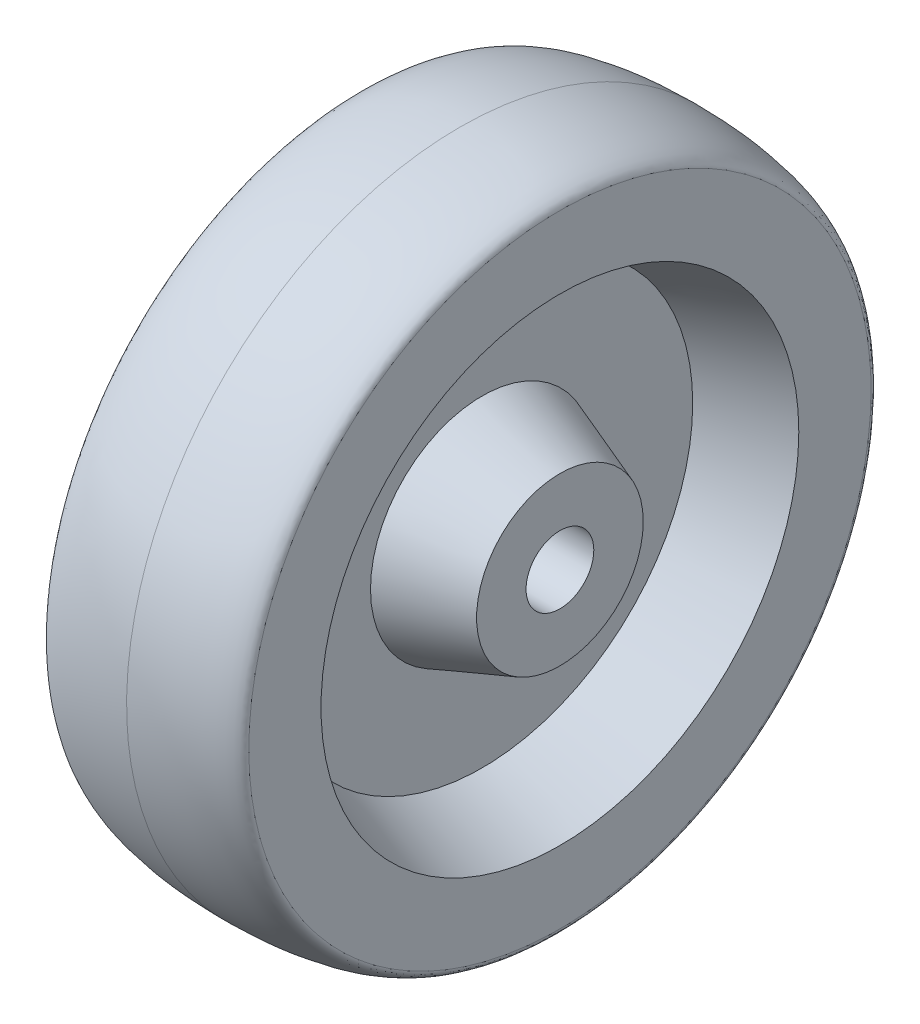
ISO-10303-21;
HEADER;
FILE_DESCRIPTION(('STEP AP214'),'2;1');
FILE_NAME('part.step','',(''),(''),'','','');
FILE_SCHEMA(('AUTOMOTIVE_DESIGN { 1 0 10303 214 1 1 1 1 }'));
ENDSEC;
DATA;
#1=APPLICATION_CONTEXT('core data for automotive mechanical design processes');
#2=APPLICATION_PROTOCOL_DEFINITION('international standard','automotive_design',2000,#1);
#3=PRODUCT_CONTEXT('',#1,'mechanical');
#4=PRODUCT('Part','Part','',(#3));
#5=PRODUCT_RELATED_PRODUCT_CATEGORY('part','',(#4));
#6=PRODUCT_DEFINITION_FORMATION('','',#4);
#7=PRODUCT_DEFINITION_CONTEXT('part definition',#1,'design');
#8=PRODUCT_DEFINITION('design','',#6,#7);
#9=PRODUCT_DEFINITION_SHAPE('','',#8);
#10=(LENGTH_UNIT() NAMED_UNIT(*) SI_UNIT(.MILLI.,.METRE.));
#11=(NAMED_UNIT(*) PLANE_ANGLE_UNIT() SI_UNIT($,.RADIAN.));
#12=(NAMED_UNIT(*) SI_UNIT($,.STERADIAN.) SOLID_ANGLE_UNIT());
#13=UNCERTAINTY_MEASURE_WITH_UNIT(LENGTH_MEASURE(1.E-05),#10,'distance_accuracy_value','');
#14=(GEOMETRIC_REPRESENTATION_CONTEXT(3) GLOBAL_UNCERTAINTY_ASSIGNED_CONTEXT((#13)) GLOBAL_UNIT_ASSIGNED_CONTEXT((#10,
#11,#12)) REPRESENTATION_CONTEXT('',''));
#15=CARTESIAN_POINT('',(0.,0.,0.));
#16=DIRECTION('',(0.,0.,1.));
#17=DIRECTION('',(1.,0.,0.));
#18=AXIS2_PLACEMENT_3D('',#15,#16,#17);
#19=CARTESIAN_POINT('',(-9.,0.,0.));
#20=DIRECTION('',(1.,0.,0.));
#21=DIRECTION('',(0.,0.,-1.));
#22=AXIS2_PLACEMENT_3D('',#19,#20,#21);
#23=PLANE('',#22);
#24=CARTESIAN_POINT('',(-9.,0.,0.));
#25=DIRECTION('',(1.,0.,0.));
#26=DIRECTION('',(0.,0.,-1.));
#27=AXIS2_PLACEMENT_3D('',#24,#25,#26);
#28=CIRCLE('',#27,3.05);
#29=CARTESIAN_POINT('',(-9.,0.,-3.05));
#30=VERTEX_POINT('',#29);
#31=EDGE_CURVE('E65',#30,#30,#28,.T.);
#32=ORIENTED_EDGE('',*,*,#31,.T.);
#33=EDGE_LOOP('',(#32));
#34=FACE_BOUND('',#33,.T.);
#35=CARTESIAN_POINT('',(-9.,0.,0.));
#36=DIRECTION('',(1.,0.,0.));
#37=DIRECTION('',(0.,0.,-1.));
#38=AXIS2_PLACEMENT_3D('',#35,#36,#37);
#39=CIRCLE('',#38,7.5);
#40=CARTESIAN_POINT('',(-9.,0.,-7.5));
#41=VERTEX_POINT('',#40);
#42=EDGE_CURVE('E130',#41,#41,#39,.T.);
#43=ORIENTED_EDGE('',*,*,#42,.F.);
#44=EDGE_LOOP('',(#43));
#45=FACE_BOUND('',#44,.T.);
#46=ADVANCED_FACE('F42',(#34,#45),#23,.F.);
#47=CARTESIAN_POINT('',(9.,0.,0.));
#48=DIRECTION('',(1.,0.,0.));
#49=DIRECTION('',(0.,0.,-1.));
#50=AXIS2_PLACEMENT_3D('',#47,#48,#49);
#51=PLANE('',#50);
#52=CARTESIAN_POINT('',(9.,0.,0.));
#53=DIRECTION('',(1.,0.,0.));
#54=DIRECTION('',(0.,0.,-1.));
#55=AXIS2_PLACEMENT_3D('',#52,#53,#54);
#56=CIRCLE('',#55,3.05);
#57=CARTESIAN_POINT('',(9.,0.,-3.05));
#58=VERTEX_POINT('',#57);
#59=EDGE_CURVE('E60',#58,#58,#56,.T.);
#60=ORIENTED_EDGE('',*,*,#59,.F.);
#61=EDGE_LOOP('',(#60));
#62=FACE_BOUND('',#61,.T.);
#63=CARTESIAN_POINT('',(9.,0.,0.));
#64=DIRECTION('',(1.,0.,0.));
#65=DIRECTION('',(0.,0.,-1.));
#66=AXIS2_PLACEMENT_3D('',#63,#64,#65);
#67=CIRCLE('',#66,7.5);
#68=CARTESIAN_POINT('',(9.,0.,-7.5));
#69=VERTEX_POINT('',#68);
#70=EDGE_CURVE('E151',#69,#69,#67,.T.);
#71=ORIENTED_EDGE('',*,*,#70,.T.);
#72=EDGE_LOOP('',(#71));
#73=FACE_BOUND('',#72,.T.);
#74=ADVANCED_FACE('F178',(#62,#73),#51,.T.);
#75=CARTESIAN_POINT('',(9.,0.,-28.));
#76=CARTESIAN_POINT('',(9.,-3.66519142843676,-28.));
#77=CARTESIAN_POINT('',(9.,-7.32894076278233,-27.2712349464135));
#78=CARTESIAN_POINT('',(9.,-14.1013314496628,-24.4660188742185));
#79=CARTESIAN_POINT('',(9.,-17.2073081598448,-22.3906715865955));
#80=CARTESIAN_POINT('',(9.,-22.390671586602,-17.207308159851));
#81=CARTESIAN_POINT('',(9.,-24.4660188742185,-14.1013314496659));
#82=CARTESIAN_POINT('',(9.,-27.2712349464136,-7.32894076277907));
#83=CARTESIAN_POINT('',(9.,-28.,-3.66519142840898));
#84=CARTESIAN_POINT('',(9.,-28.,3.66519142840889));
#85=CARTESIAN_POINT('',(9.,-27.2712349464135,7.32894076278233));
#86=CARTESIAN_POINT('',(9.,-24.4660188742185,14.1013314496628));
#87=CARTESIAN_POINT('',(9.,-22.3906715865961,17.2073081598442));
#88=CARTESIAN_POINT('',(9.,-17.2073081598506,22.3906715866024));
#89=CARTESIAN_POINT('',(9.,-14.1013314496667,24.4660188742202));
#90=CARTESIAN_POINT('',(9.,-7.3289407627783,27.2712349464119));
#91=CARTESIAN_POINT('',(9.,-3.66519142840892,28.));
#92=CARTESIAN_POINT('',(9.,3.66519142840893,28.));
#93=CARTESIAN_POINT('',(9.,7.32894076278155,27.2712349464119));
#94=CARTESIAN_POINT('',(9.,14.1013314496635,24.4660188742201));
#95=CARTESIAN_POINT('',(9.,17.2073081598442,22.3906715866024));
#96=CARTESIAN_POINT('',(9.,22.3906715866024,17.2073081598443));
#97=CARTESIAN_POINT('',(9.,24.4660188742161,14.1013314496679));
#98=CARTESIAN_POINT('',(9.,27.2712349464159,7.32894076277714));
#99=CARTESIAN_POINT('',(9.,28.,3.66519142840892));
#100=CARTESIAN_POINT('',(9.,28.,-3.66519142840893));
#101=CARTESIAN_POINT('',(9.,27.2712349464159,-7.32894076278348));
#102=CARTESIAN_POINT('',(9.,24.4660188742162,-14.1013314496615));
#103=CARTESIAN_POINT('',(9.,22.3906715865943,-17.2073081598587));
#104=CARTESIAN_POINT('',(9.,17.2073081598523,-22.390671586588));
#105=CARTESIAN_POINT('',(9.,14.1013314496668,-24.466018874214));
#106=CARTESIAN_POINT('',(9.,7.32894076277823,-27.2712349464181));
#107=CARTESIAN_POINT('',(9.,3.66519142843676,-28.));
#108=CARTESIAN_POINT('',(9.,0.,-28.));
#109=(BOUNDED_CURVE() B_SPLINE_CURVE(3,(#75,#76,#77,#78,#79,#80,#81,#82,#83,#84,#85,#86,#87,#88,
#89,#90,#91,#92,#93,#94,#95,#96,#97,#98,#99,#100,#101,#102,#103,#104,#105,#106,#107,#108),
.UNSPECIFIED.,.T.,.F.) B_SPLINE_CURVE_WITH_KNOTS((4,2,2,2,2,2,2,2,2,2,2,2,2,2,2,2,4),(0.,
0.392699081698725,0.785398163397448,1.17809724509617,1.5707963267949,1.96349540849362,
2.35619449019234,2.74889357189107,3.14159265358979,3.53429173528852,3.92699081698724,
4.31968989868597,4.71238898038469,5.10508806208341,5.49778714378214,5.89048622548086,
6.28318530717959),
.UNSPECIFIED.) CURVE() GEOMETRIC_REPRESENTATION_ITEM() RATIONAL_B_SPLINE_CURVE((1.,1.,1.,1.,1.,
1.,1.,1.,1.,1.,1.,1.,1.,1.,1.,1.,1.,1.,1.,1.,1.,1.,1.,1.,1.,1.,1.,1.,1.,1.,1.,1.,1.,1.)) REPRESENTATION_ITEM(''));
#110=CARTESIAN_POINT('',(9.,0.,-28.));
#111=VERTEX_POINT('',#110);
#112=EDGE_CURVE('E11',#111,#111,#109,.F.);
#113=ORIENTED_EDGE('',*,*,#112,.T.);
#114=EDGE_LOOP('',(#113));
#115=FACE_BOUND('',#114,.T.);
#116=CARTESIAN_POINT('',(9.,0.,0.));
#117=DIRECTION('',(1.,0.,0.));
#118=DIRECTION('',(0.,0.,-1.));
#119=AXIS2_PLACEMENT_3D('',#116,#117,#118);
#120=CIRCLE('',#119,21.5);
#121=CARTESIAN_POINT('',(9.,0.,-21.5));
#122=VERTEX_POINT('',#121);
#123=EDGE_CURVE('E156',#122,#122,#120,.T.);
#124=ORIENTED_EDGE('',*,*,#123,.F.);
#125=EDGE_LOOP('',(#124));
#126=FACE_BOUND('',#125,.T.);
#127=ADVANCED_FACE('F89',(#115,#126),#51,.T.);
#128=CARTESIAN_POINT('',(-9.,0.,-28.));
#129=CARTESIAN_POINT('',(-9.,3.66519142843676,-28.));
#130=CARTESIAN_POINT('',(-9.,7.32894076277823,-27.2712349464181));
#131=CARTESIAN_POINT('',(-9.,14.1013314496668,-24.466018874214));
#132=CARTESIAN_POINT('',(-9.,17.2073081598523,-22.390671586588));
#133=CARTESIAN_POINT('',(-9.,22.3906715865943,-17.2073081598587));
#134=CARTESIAN_POINT('',(-9.,24.4660188742162,-14.1013314496615));
#135=CARTESIAN_POINT('',(-9.,27.2712349464159,-7.32894076278348));
#136=CARTESIAN_POINT('',(-9.,28.,-3.66519142840893));
#137=CARTESIAN_POINT('',(-9.,28.,3.66519142840892));
#138=CARTESIAN_POINT('',(-9.,27.2712349464159,7.32894076277714));
#139=CARTESIAN_POINT('',(-9.,24.4660188742161,14.1013314496679));
#140=CARTESIAN_POINT('',(-9.,22.3906715866024,17.2073081598443));
#141=CARTESIAN_POINT('',(-9.,17.2073081598442,22.3906715866024));
#142=CARTESIAN_POINT('',(-9.,14.1013314496635,24.4660188742201));
#143=CARTESIAN_POINT('',(-9.,7.32894076278155,27.2712349464119));
#144=CARTESIAN_POINT('',(-9.,3.66519142840893,28.));
#145=CARTESIAN_POINT('',(-9.,-3.66519142840892,28.));
#146=CARTESIAN_POINT('',(-9.,-7.3289407627783,27.2712349464119));
#147=CARTESIAN_POINT('',(-9.,-14.1013314496667,24.4660188742202));
#148=CARTESIAN_POINT('',(-9.,-17.2073081598506,22.3906715866024));
#149=CARTESIAN_POINT('',(-9.,-22.3906715865961,17.2073081598442));
#150=CARTESIAN_POINT('',(-9.,-24.4660188742185,14.1013314496628));
#151=CARTESIAN_POINT('',(-9.,-27.2712349464135,7.32894076278233));
#152=CARTESIAN_POINT('',(-9.,-28.,3.66519142840889));
#153=CARTESIAN_POINT('',(-9.,-28.,-3.66519142840898));
#154=CARTESIAN_POINT('',(-9.,-27.2712349464136,-7.32894076277907));
#155=CARTESIAN_POINT('',(-9.,-24.4660188742185,-14.1013314496659));
#156=CARTESIAN_POINT('',(-9.,-22.390671586602,-17.207308159851));
#157=CARTESIAN_POINT('',(-9.,-17.2073081598448,-22.3906715865955));
#158=CARTESIAN_POINT('',(-9.,-14.1013314496628,-24.4660188742185));
#159=CARTESIAN_POINT('',(-9.,-7.32894076278233,-27.2712349464135));
#160=CARTESIAN_POINT('',(-9.,-3.66519142843676,-28.));
#161=CARTESIAN_POINT('',(-9.,0.,-28.));
#162=(BOUNDED_CURVE() B_SPLINE_CURVE(3,(#128,#129,#130,#131,#132,#133,#134,#135,#136,#137,#138,
#139,#140,#141,#142,#143,#144,#145,#146,#147,#148,#149,#150,#151,#152,#153,#154,#155,#156,#157,
#158,#159,#160,#161),.UNSPECIFIED.,.T.,.F.) B_SPLINE_CURVE_WITH_KNOTS((4,2,2,2,2,2,2,2,2,2,2,2,
2,2,2,2,4),(0.,0.392699081698724,0.785398163397448,1.17809724509617,1.5707963267949,
1.96349540849362,2.35619449019234,2.74889357189107,3.14159265358979,3.53429173528852,
3.92699081698724,4.31968989868597,4.71238898038469,5.10508806208341,5.49778714378214,
5.89048622548086,6.28318530717959),
.UNSPECIFIED.) CURVE() GEOMETRIC_REPRESENTATION_ITEM() RATIONAL_B_SPLINE_CURVE((1.,1.,1.,1.,1.,
1.,1.,1.,1.,1.,1.,1.,1.,1.,1.,1.,1.,1.,1.,1.,1.,1.,1.,1.,1.,1.,1.,1.,1.,1.,1.,1.,1.,1.)) REPRESENTATION_ITEM(''));
#163=CARTESIAN_POINT('',(-9.,0.,-28.));
#164=VERTEX_POINT('',#163);
#165=EDGE_CURVE('E55',#164,#164,#162,.F.);
#166=ORIENTED_EDGE('',*,*,#165,.T.);
#167=EDGE_LOOP('',(#166));
#168=FACE_BOUND('',#167,.T.);
#169=CARTESIAN_POINT('',(-9.,0.,0.));
#170=DIRECTION('',(1.,0.,0.));
#171=DIRECTION('',(0.,0.,-1.));
#172=AXIS2_PLACEMENT_3D('',#169,#170,#171);
#173=CIRCLE('',#172,21.5);
#174=CARTESIAN_POINT('',(-9.,0.,-21.5));
#175=VERTEX_POINT('',#174);
#176=EDGE_CURVE('E144',#175,#175,#173,.T.);
#177=ORIENTED_EDGE('',*,*,#176,.T.);
#178=EDGE_LOOP('',(#177));
#179=FACE_BOUND('',#178,.T.);
#180=ADVANCED_FACE('F79',(#168,#179),#23,.F.);
#181=CARTESIAN_POINT('',(9.,0.,0.));
#182=DIRECTION('',(-1.,0.,0.));
#183=DIRECTION('',(0.,0.,1.));
#184=AXIS2_PLACEMENT_3D('',#181,#182,#183);
#185=CYLINDRICAL_SURFACE('',#184,3.05);
#186=ORIENTED_EDGE('',*,*,#59,.T.);
#187=EDGE_LOOP('',(#186));
#188=FACE_BOUND('',#187,.T.);
#189=ORIENTED_EDGE('',*,*,#31,.F.);
#190=EDGE_LOOP('',(#189));
#191=FACE_BOUND('',#190,.T.);
#192=ADVANCED_FACE('F88',(#188,#191),#185,.F.);
#193=CARTESIAN_POINT('',(9.,0.,0.));
#194=DIRECTION('',(1.,0.,0.));
#195=DIRECTION('',(0.,0.,-1.));
#196=AXIS2_PLACEMENT_3D('',#193,#194,#195);
#197=CONICAL_SURFACE('',#196,21.5,0.349065850398867);
#198=CARTESIAN_POINT('',(2.,0.,0.));
#199=DIRECTION('',(1.,0.,0.));
#200=DIRECTION('',(0.,0.,-1.));
#201=AXIS2_PLACEMENT_3D('',#198,#199,#200);
#202=CIRCLE('',#201,18.9522083601366);
#203=CARTESIAN_POINT('',(2.,0.,-18.9522083601366));
#204=VERTEX_POINT('',#203);
#205=EDGE_CURVE('E70',#204,#204,#202,.T.);
#206=ORIENTED_EDGE('',*,*,#205,.F.);
#207=EDGE_LOOP('',(#206));
#208=FACE_BOUND('',#207,.T.);
#209=ORIENTED_EDGE('',*,*,#123,.T.);
#210=EDGE_LOOP('',(#209));
#211=FACE_BOUND('',#210,.T.);
#212=ADVANCED_FACE('F167',(#208,#211),#197,.F.);
#213=CARTESIAN_POINT('',(2.,0.,0.));
#214=DIRECTION('',(1.,0.,0.));
#215=DIRECTION('',(0.,0.,-1.));
#216=AXIS2_PLACEMENT_3D('',#213,#214,#215);
#217=PLANE('',#216);
#218=CARTESIAN_POINT('',(2.,0.,0.));
#219=DIRECTION('',(1.,0.,0.));
#220=DIRECTION('',(0.,0.,-1.));
#221=AXIS2_PLACEMENT_3D('',#218,#219,#220);
#222=CIRCLE('',#221,10.0477916398634);
#223=CARTESIAN_POINT('',(2.,0.,-10.0477916398634));
#224=VERTEX_POINT('',#223);
#225=EDGE_CURVE('E155',#224,#224,#222,.T.);
#226=ORIENTED_EDGE('',*,*,#225,.F.);
#227=EDGE_LOOP('',(#226));
#228=FACE_BOUND('',#227,.T.);
#229=ORIENTED_EDGE('',*,*,#205,.T.);
#230=EDGE_LOOP('',(#229));
#231=FACE_BOUND('',#230,.T.);
#232=ADVANCED_FACE('F164',(#228,#231),#217,.T.);
#233=CARTESIAN_POINT('',(9.,0.,0.));
#234=DIRECTION('',(-1.,0.,0.));
#235=DIRECTION('',(0.,0.,-1.));
#236=AXIS2_PLACEMENT_3D('',#233,#234,#235);
#237=CONICAL_SURFACE('',#236,7.5,0.349065850398867);
#238=ORIENTED_EDGE('',*,*,#225,.T.);
#239=EDGE_LOOP('',(#238));
#240=FACE_BOUND('',#239,.T.);
#241=ORIENTED_EDGE('',*,*,#70,.F.);
#242=EDGE_LOOP('',(#241));
#243=FACE_BOUND('',#242,.T.);
#244=ADVANCED_FACE('F161',(#240,#243),#237,.T.);
#245=CARTESIAN_POINT('',(-2.,0.,0.));
#246=DIRECTION('',(-1.,0.,0.));
#247=DIRECTION('',(0.,0.,-1.));
#248=AXIS2_PLACEMENT_3D('',#245,#246,#247);
#249=PLANE('',#248);
#250=CARTESIAN_POINT('',(-2.,0.,0.));
#251=DIRECTION('',(-1.,0.,0.));
#252=DIRECTION('',(0.,0.,1.));
#253=AXIS2_PLACEMENT_3D('',#250,#251,#252);
#254=CIRCLE('',#253,18.9522083601366);
#255=CARTESIAN_POINT('',(-2.,0.,18.9522083601366));
#256=VERTEX_POINT('',#255);
#257=EDGE_CURVE('E149',#256,#256,#254,.F.);
#258=ORIENTED_EDGE('',*,*,#257,.F.);
#259=EDGE_LOOP('',(#258));
#260=FACE_BOUND('',#259,.T.);
#261=CARTESIAN_POINT('',(-2.,0.,0.));
#262=DIRECTION('',(-1.,0.,0.));
#263=DIRECTION('',(0.,0.,1.));
#264=AXIS2_PLACEMENT_3D('',#261,#262,#263);
#265=CIRCLE('',#264,10.0477916398634);
#266=CARTESIAN_POINT('',(-2.,0.,10.0477916398634));
#267=VERTEX_POINT('',#266);
#268=EDGE_CURVE('E139',#267,#267,#265,.F.);
#269=ORIENTED_EDGE('',*,*,#268,.T.);
#270=EDGE_LOOP('',(#269));
#271=FACE_BOUND('',#270,.T.);
#272=ADVANCED_FACE('F197',(#260,#271),#249,.T.);
#273=CARTESIAN_POINT('',(-9.,0.,0.));
#274=DIRECTION('',(-1.,0.,0.));
#275=DIRECTION('',(0.,0.,-1.));
#276=AXIS2_PLACEMENT_3D('',#273,#274,#275);
#277=CONICAL_SURFACE('',#276,21.5,0.349065850398867);
#278=ORIENTED_EDGE('',*,*,#257,.T.);
#279=EDGE_LOOP('',(#278));
#280=FACE_BOUND('',#279,.T.);
#281=ORIENTED_EDGE('',*,*,#176,.F.);
#282=EDGE_LOOP('',(#281));
#283=FACE_BOUND('',#282,.T.);
#284=ADVANCED_FACE('F200',(#280,#283),#277,.F.);
#285=CARTESIAN_POINT('',(-9.,0.,0.));
#286=DIRECTION('',(1.,0.,0.));
#287=DIRECTION('',(0.,0.,-1.));
#288=AXIS2_PLACEMENT_3D('',#285,#286,#287);
#289=CONICAL_SURFACE('',#288,7.5,0.349065850398867);
#290=ORIENTED_EDGE('',*,*,#268,.F.);
#291=EDGE_LOOP('',(#290));
#292=FACE_BOUND('',#291,.T.);
#293=ORIENTED_EDGE('',*,*,#42,.T.);
#294=EDGE_LOOP('',(#293));
#295=FACE_BOUND('',#294,.T.);
#296=ADVANCED_FACE('F125',(#292,#295),#289,.T.);
#297=CARTESIAN_POINT('',(9.,0.,-28.));
#298=CARTESIAN_POINT('',(9.,3.66519142843676,-28.));
#299=CARTESIAN_POINT('',(9.,7.32894076277823,-27.2712349464181));
#300=CARTESIAN_POINT('',(9.,14.1013314496668,-24.466018874214));
#301=CARTESIAN_POINT('',(9.,17.2073081598523,-22.390671586588));
#302=CARTESIAN_POINT('',(9.,22.3906715865943,-17.2073081598587));
#303=CARTESIAN_POINT('',(9.,24.4660188742162,-14.1013314496615));
#304=CARTESIAN_POINT('',(9.,27.2712349464159,-7.32894076278348));
#305=CARTESIAN_POINT('',(9.,28.,-3.66519142840893));
#306=CARTESIAN_POINT('',(9.,28.,3.66519142840892));
#307=CARTESIAN_POINT('',(9.,27.2712349464159,7.32894076277714));
#308=CARTESIAN_POINT('',(9.,24.4660188742161,14.1013314496679));
#309=CARTESIAN_POINT('',(9.,22.3906715866024,17.2073081598443));
#310=CARTESIAN_POINT('',(9.,17.2073081598442,22.3906715866024));
#311=CARTESIAN_POINT('',(9.,14.1013314496635,24.4660188742201));
#312=CARTESIAN_POINT('',(9.,7.32894076278155,27.2712349464119));
#313=CARTESIAN_POINT('',(9.,3.66519142840893,28.));
#314=CARTESIAN_POINT('',(9.,-3.66519142840892,28.));
#315=CARTESIAN_POINT('',(9.,-7.3289407627783,27.2712349464119));
#316=CARTESIAN_POINT('',(9.,-14.1013314496667,24.4660188742202));
#317=CARTESIAN_POINT('',(9.,-17.2073081598506,22.3906715866024));
#318=CARTESIAN_POINT('',(9.,-22.3906715865961,17.2073081598442));
#319=CARTESIAN_POINT('',(9.,-24.4660188742185,14.1013314496628));
#320=CARTESIAN_POINT('',(9.,-27.2712349464135,7.32894076278233));
#321=CARTESIAN_POINT('',(9.,-28.,3.66519142840889));
#322=CARTESIAN_POINT('',(9.,-28.,-3.66519142840898));
#323=CARTESIAN_POINT('',(9.,-27.2712349464136,-7.32894076277907));
#324=CARTESIAN_POINT('',(9.,-24.4660188742185,-14.1013314496659));
#325=CARTESIAN_POINT('',(9.,-22.390671586602,-17.207308159851));
#326=CARTESIAN_POINT('',(9.,-17.2073081598448,-22.3906715865955));
#327=CARTESIAN_POINT('',(9.,-14.1013314496628,-24.4660188742185));
#328=CARTESIAN_POINT('',(9.,-7.32894076278233,-27.2712349464135));
#329=CARTESIAN_POINT('',(9.,-3.66519142843676,-28.));
#330=CARTESIAN_POINT('',(9.,0.,-28.));
#331=CARTESIAN_POINT('',(9.,0.,-30.));
#332=CARTESIAN_POINT('',(9.,3.92699081618224,-30.0000000000064));
#333=CARTESIAN_POINT('',(9.,7.85243653154561,-29.2191802997305));
#334=CARTESIAN_POINT('',(9.,15.1085694103598,-26.2135916509467));
#335=CARTESIAN_POINT('',(9.,18.4364015998445,-23.990005271342));
#336=CARTESIAN_POINT('',(9.,23.9900052713484,-18.4364015998508));
#337=CARTESIAN_POINT('',(9.,26.2135916509427,-15.1085694103541));
#338=CARTESIAN_POINT('',(9.,29.2191802997345,-7.85243653155123));
#339=CARTESIAN_POINT('',(8.99999999999682,30.,-3.92699081615242));
#340=CARTESIAN_POINT('',(9.00000000000318,30.,3.92699081615242));
#341=CARTESIAN_POINT('',(9.,29.2191802997281,7.8524365315449));
#342=CARTESIAN_POINT('',(9.,26.213591650949,15.1085694103605));
#343=CARTESIAN_POINT('',(9.,23.990005271357,18.4364015998295));
#344=CARTESIAN_POINT('',(9.,18.4364015998358,23.9900052713634));
#345=CARTESIAN_POINT('',(8.99999999999682,15.1085694103513,26.2135916509524));
#346=CARTESIAN_POINT('',(9.00000000000318,7.85243653155416,29.2191802997248));
#347=CARTESIAN_POINT('',(9.,3.92699081615242,30.));
#348=CARTESIAN_POINT('',(9.,-3.92699081615242,30.));
#349=CARTESIAN_POINT('',(9.,-7.8524365315509,29.2191802997311));
#350=CARTESIAN_POINT('',(9.,-15.1085694103544,26.2135916509461));
#351=CARTESIAN_POINT('',(9.,-18.4364015998359,23.990005271357));
#352=CARTESIAN_POINT('',(9.,-23.990005271357,18.4364015998358));
#353=CARTESIAN_POINT('',(9.,-26.213591650952,15.1085694103475));
#354=CARTESIAN_POINT('',(9.,-29.2191802997251,7.85243653155794));
#355=CARTESIAN_POINT('',(9.,-30.,3.92699081615238));
#356=CARTESIAN_POINT('',(9.,-30.,-3.92699081615247));
#357=CARTESIAN_POINT('',(8.99999999999682,-29.2191802997315,-7.85243653154832));
#358=CARTESIAN_POINT('',(9.00000000000318,-26.2135916509457,-15.108569410357));
#359=CARTESIAN_POINT('',(9.,-23.9900052713607,-18.4364015998449));
#360=CARTESIAN_POINT('',(9.,-18.4364015998323,-23.9900052713478));
#361=CARTESIAN_POINT('',(8.99999999999682,-15.1085694103475,-26.213591650952));
#362=CARTESIAN_POINT('',(9.00000000000318,-7.85243653155795,-29.2191802997251));
#363=CARTESIAN_POINT('',(9.,-3.92699081618224,-29.9999999999936));
#364=CARTESIAN_POINT('',(9.,0.,-30.));
#365=CARTESIAN_POINT('',(0.,0.,-30.));
#366=CARTESIAN_POINT('',(0.,3.92699081618224,-30.));
#367=CARTESIAN_POINT('',(0.,7.85243653154874,-29.2191802997304));
#368=CARTESIAN_POINT('',(0.,15.1085694103566,-26.2135916509468));
#369=CARTESIAN_POINT('',(0.,18.4364015998477,-23.9900052713452));
#370=CARTESIAN_POINT('',(0.,23.9900052713452,-18.4364015998477));
#371=CARTESIAN_POINT('',(0.,26.2135916509482,-15.1085694103532));
#372=CARTESIAN_POINT('',(0.,29.219180299729,-7.85243653155212));
#373=CARTESIAN_POINT('',(0.,30.,-3.92699081615242));
#374=CARTESIAN_POINT('',(0.,30.,3.92699081615242));
#375=CARTESIAN_POINT('',(0.,29.2191802997314,7.85243653154625));
#376=CARTESIAN_POINT('',(0.,26.2135916509458,15.1085694103592));
#377=CARTESIAN_POINT('',(0.,23.9900052713602,18.4364015998327));
#378=CARTESIAN_POINT('',(0.,18.4364015998327,23.9900052713602));
#379=CARTESIAN_POINT('',(0.,15.1085694103528,26.2135916509484));
#380=CARTESIAN_POINT('',(0.,7.85243653155264,29.2191802997288));
#381=CARTESIAN_POINT('',(0.,3.92699081615242,30.));
#382=CARTESIAN_POINT('',(0.,-3.92699081615242,30.));
#383=CARTESIAN_POINT('',(0.,-7.8524365315476,29.2191802997308));
#384=CARTESIAN_POINT('',(0.,-15.1085694103577,26.2135916509464));
#385=CARTESIAN_POINT('',(0.,-18.4364015998359,23.990005271357));
#386=CARTESIAN_POINT('',(0.,-23.990005271357,18.4364015998358));
#387=CARTESIAN_POINT('',(0.,-26.2135916509497,15.1085694103497));
#388=CARTESIAN_POINT('',(0.,-29.2191802997275,7.85243653155574));
#389=CARTESIAN_POINT('',(0.,-30.,3.92699081615238));
#390=CARTESIAN_POINT('',(0.,-30.,-3.92699081615247));
#391=CARTESIAN_POINT('',(0.,-29.2191802997307,-7.85243653154797));
#392=CARTESIAN_POINT('',(0.,-26.2135916509465,-15.1085694103573));
#393=CARTESIAN_POINT('',(0.,-23.9900052713543,-18.4364015998385));
#394=CARTESIAN_POINT('',(0.,-18.4364015998387,-23.9900052713542));
#395=CARTESIAN_POINT('',(0.,-15.1085694103497,-26.2135916509497));
#396=CARTESIAN_POINT('',(0.,-7.85243653155574,-29.2191802997275));
#397=CARTESIAN_POINT('',(0.,-3.92699081618224,-30.));
#398=CARTESIAN_POINT('',(0.,0.,-30.));
#399=(BOUNDED_SURFACE() B_SPLINE_SURFACE(2,3,((#297,#298,#299,#300,#301,#302,#303,#304,#305,
#306,#307,#308,#309,#310,#311,#312,#313,#314,#315,#316,#317,#318,#319,#320,#321,#322,#323,#324,
#325,#326,#327,#328,#329,#330),(#331,#332,#333,#334,#335,#336,#337,#338,#339,#340,#341,#342,
#343,#344,#345,#346,#347,#348,#349,#350,#351,#352,#353,#354,#355,#356,#357,#358,#359,#360,#361,
#362,#363,#364),(#365,#366,#367,#368,#369,#370,#371,#372,#373,#374,#375,#376,#377,#378,#379,
#380,#381,#382,#383,#384,#385,#386,#387,#388,#389,#390,#391,#392,#393,#394,#395,#396,#397,
#398)),.UNSPECIFIED.,.F.,.T.,.F.) B_SPLINE_SURFACE_WITH_KNOTS((3,3),(4,2,2,2,2,2,2,2,2,2,2,2,2,
2,2,2,4),(0.,1.),(0.,0.392699081698724,0.785398163397448,1.17809724509617,1.5707963267949,
1.96349540849362,2.35619449019234,2.74889357189107,3.14159265358979,3.53429173528852,
3.92699081698724,4.31968989868597,4.71238898038469,5.10508806208341,5.49778714378214,
5.89048622548086,6.28318530717959),
.UNSPECIFIED.) GEOMETRIC_REPRESENTATION_ITEM() RATIONAL_B_SPLINE_SURFACE(((1.,1.,1.,1.,1.,1.,1.,
1.,1.,1.,1.,1.,1.,1.,1.,1.,1.,1.,1.,1.,1.,1.,1.,1.,1.,1.,1.,1.,1.,1.,1.,1.,1.,1.),
(0.707106781186548,0.707106781186548,0.707106781186548,0.707106781186548,0.707106781186548,
0.707106781186548,0.707106781186548,0.707106781186548,0.707106781186548,0.707106781186548,
0.707106781186548,0.707106781186548,0.707106781186548,0.707106781186548,0.707106781186548,
0.707106781186548,0.707106781186548,0.707106781186548,0.707106781186548,0.707106781186548,
0.707106781186548,0.707106781186548,0.707106781186548,0.707106781186548,0.707106781186548,
0.707106781186548,0.707106781186548,0.707106781186548,0.707106781186548,0.707106781186548,
0.707106781186548,0.707106781186548,0.707106781186548,0.707106781186548),(1.,1.,1.,1.,1.,1.,1.,
1.,1.,1.,1.,1.,1.,1.,1.,1.,1.,1.,1.,1.,1.,1.,1.,1.,1.,1.,1.,1.,1.,1.,1.,1.,1.,1.))) REPRESENTATION_ITEM('') SURFACE());
#400=CARTESIAN_POINT('',(0.,0.,-30.));
#401=CARTESIAN_POINT('',(0.,-3.92699081618224,-30.));
#402=CARTESIAN_POINT('',(0.,-7.85243653155574,-29.2191802997275));
#403=CARTESIAN_POINT('',(0.,-15.1085694103497,-26.2135916509497));
#404=CARTESIAN_POINT('',(0.,-18.4364015998387,-23.9900052713542));
#405=CARTESIAN_POINT('',(0.,-23.9900052713543,-18.4364015998385));
#406=CARTESIAN_POINT('',(0.,-26.2135916509465,-15.1085694103573));
#407=CARTESIAN_POINT('',(0.,-29.2191802997307,-7.85243653154797));
#408=CARTESIAN_POINT('',(0.,-30.,-3.92699081615247));
#409=CARTESIAN_POINT('',(0.,-30.,3.92699081615238));
#410=CARTESIAN_POINT('',(0.,-29.2191802997275,7.85243653155574));
#411=CARTESIAN_POINT('',(0.,-26.2135916509497,15.1085694103497));
#412=CARTESIAN_POINT('',(0.,-23.990005271357,18.4364015998358));
#413=CARTESIAN_POINT('',(0.,-18.4364015998359,23.990005271357));
#414=CARTESIAN_POINT('',(0.,-15.1085694103577,26.2135916509464));
#415=CARTESIAN_POINT('',(0.,-7.8524365315476,29.2191802997308));
#416=CARTESIAN_POINT('',(0.,-3.92699081615242,30.));
#417=CARTESIAN_POINT('',(0.,3.92699081615242,30.));
#418=CARTESIAN_POINT('',(0.,7.85243653155264,29.2191802997288));
#419=CARTESIAN_POINT('',(0.,15.1085694103528,26.2135916509484));
#420=CARTESIAN_POINT('',(0.,18.4364015998327,23.9900052713602));
#421=CARTESIAN_POINT('',(0.,23.9900052713602,18.4364015998327));
#422=CARTESIAN_POINT('',(0.,26.2135916509458,15.1085694103592));
#423=CARTESIAN_POINT('',(0.,29.2191802997314,7.85243653154625));
#424=CARTESIAN_POINT('',(0.,30.,3.92699081615242));
#425=CARTESIAN_POINT('',(0.,30.,-3.92699081615242));
#426=CARTESIAN_POINT('',(0.,29.219180299729,-7.85243653155212));
#427=CARTESIAN_POINT('',(0.,26.2135916509482,-15.1085694103532));
#428=CARTESIAN_POINT('',(0.,23.9900052713452,-18.4364015998477));
#429=CARTESIAN_POINT('',(0.,18.4364015998477,-23.9900052713452));
#430=CARTESIAN_POINT('',(0.,15.1085694103566,-26.2135916509468));
#431=CARTESIAN_POINT('',(0.,7.85243653154874,-29.2191802997304));
#432=CARTESIAN_POINT('',(0.,3.92699081618224,-30.));
#433=CARTESIAN_POINT('',(0.,0.,-30.));
#434=(BOUNDED_CURVE() B_SPLINE_CURVE(3,(#400,#401,#402,#403,#404,#405,#406,#407,#408,#409,#410,
#411,#412,#413,#414,#415,#416,#417,#418,#419,#420,#421,#422,#423,#424,#425,#426,#427,#428,#429,
#430,#431,#432,#433),.UNSPECIFIED.,.T.,.F.) B_SPLINE_CURVE_WITH_KNOTS((4,2,2,2,2,2,2,2,2,2,2,2,
2,2,2,2,4),(0.,0.392699081698725,0.785398163397448,1.17809724509617,1.5707963267949,
1.96349540849362,2.35619449019234,2.74889357189107,3.14159265358979,3.53429173528852,
3.92699081698724,4.31968989868597,4.71238898038469,5.10508806208341,5.49778714378214,
5.89048622548086,6.28318530717959),
.UNSPECIFIED.) CURVE() GEOMETRIC_REPRESENTATION_ITEM() RATIONAL_B_SPLINE_CURVE((1.,1.,1.,1.,1.,
1.,1.,1.,1.,1.,1.,1.,1.,1.,1.,1.,1.,1.,1.,1.,1.,1.,1.,1.,1.,1.,1.,1.,1.,1.,1.,1.,1.,1.)) REPRESENTATION_ITEM(''));
#435=CARTESIAN_POINT('',(0.,0.,-30.));
#436=VERTEX_POINT('',#435);
#437=EDGE_CURVE('E128',#436,#436,#434,.T.);
#438=ORIENTED_EDGE('',*,*,#112,.F.);
#439=EDGE_LOOP('',(#438));
#440=FACE_BOUND('',#439,.T.);
#441=ORIENTED_EDGE('',*,*,#437,.F.);
#442=EDGE_LOOP('',(#441));
#443=FACE_BOUND('',#442,.T.);
#444=ADVANCED_FACE('F45',(#440,#443),#399,.T.);
#445=CARTESIAN_POINT('',(0.,0.,-30.));
#446=CARTESIAN_POINT('',(0.,3.92699081618224,-30.));
#447=CARTESIAN_POINT('',(0.,7.85243653154874,-29.2191802997304));
#448=CARTESIAN_POINT('',(0.,15.1085694103566,-26.2135916509468));
#449=CARTESIAN_POINT('',(0.,18.4364015998477,-23.9900052713452));
#450=CARTESIAN_POINT('',(0.,23.9900052713452,-18.4364015998477));
#451=CARTESIAN_POINT('',(0.,26.2135916509482,-15.1085694103532));
#452=CARTESIAN_POINT('',(0.,29.219180299729,-7.85243653155212));
#453=CARTESIAN_POINT('',(0.,30.,-3.92699081615242));
#454=CARTESIAN_POINT('',(0.,30.,3.92699081615242));
#455=CARTESIAN_POINT('',(0.,29.2191802997314,7.85243653154625));
#456=CARTESIAN_POINT('',(0.,26.2135916509458,15.1085694103592));
#457=CARTESIAN_POINT('',(0.,23.9900052713602,18.4364015998327));
#458=CARTESIAN_POINT('',(0.,18.4364015998327,23.9900052713602));
#459=CARTESIAN_POINT('',(0.,15.1085694103528,26.2135916509484));
#460=CARTESIAN_POINT('',(0.,7.85243653155264,29.2191802997288));
#461=CARTESIAN_POINT('',(0.,3.92699081615242,30.));
#462=CARTESIAN_POINT('',(0.,-3.92699081615242,30.));
#463=CARTESIAN_POINT('',(0.,-7.8524365315476,29.2191802997308));
#464=CARTESIAN_POINT('',(0.,-15.1085694103577,26.2135916509464));
#465=CARTESIAN_POINT('',(0.,-18.4364015998359,23.990005271357));
#466=CARTESIAN_POINT('',(0.,-23.990005271357,18.4364015998358));
#467=CARTESIAN_POINT('',(0.,-26.2135916509497,15.1085694103497));
#468=CARTESIAN_POINT('',(0.,-29.2191802997275,7.85243653155574));
#469=CARTESIAN_POINT('',(0.,-30.,3.92699081615238));
#470=CARTESIAN_POINT('',(0.,-30.,-3.92699081615247));
#471=CARTESIAN_POINT('',(0.,-29.2191802997307,-7.85243653154797));
#472=CARTESIAN_POINT('',(0.,-26.2135916509465,-15.1085694103573));
#473=CARTESIAN_POINT('',(0.,-23.9900052713543,-18.4364015998385));
#474=CARTESIAN_POINT('',(0.,-18.4364015998387,-23.9900052713542));
#475=CARTESIAN_POINT('',(0.,-15.1085694103497,-26.2135916509497));
#476=CARTESIAN_POINT('',(0.,-7.85243653155574,-29.2191802997275));
#477=CARTESIAN_POINT('',(0.,-3.92699081618224,-30.));
#478=CARTESIAN_POINT('',(0.,0.,-30.));
#479=CARTESIAN_POINT('',(-9.,0.,-30.));
#480=CARTESIAN_POINT('',(-9.,3.92699081618224,-30.0000000000064));
#481=CARTESIAN_POINT('',(-9.,7.85243653154561,-29.2191802997305));
#482=CARTESIAN_POINT('',(-9.,15.1085694103598,-26.2135916509467));
#483=CARTESIAN_POINT('',(-9.,18.4364015998445,-23.990005271342));
#484=CARTESIAN_POINT('',(-9.,23.9900052713484,-18.4364015998508));
#485=CARTESIAN_POINT('',(-9.,26.2135916509427,-15.1085694103541));
#486=CARTESIAN_POINT('',(-9.,29.2191802997345,-7.85243653155123));
#487=CARTESIAN_POINT('',(-8.99999999999682,30.,-3.92699081615242));
#488=CARTESIAN_POINT('',(-9.00000000000318,30.,3.92699081615242));
#489=CARTESIAN_POINT('',(-9.,29.2191802997281,7.8524365315449));
#490=CARTESIAN_POINT('',(-9.,26.213591650949,15.1085694103605));
#491=CARTESIAN_POINT('',(-9.,23.990005271357,18.4364015998295));
#492=CARTESIAN_POINT('',(-9.,18.4364015998358,23.9900052713634));
#493=CARTESIAN_POINT('',(-8.99999999999682,15.1085694103513,26.2135916509524));
#494=CARTESIAN_POINT('',(-9.00000000000318,7.85243653155416,29.2191802997248));
#495=CARTESIAN_POINT('',(-9.,3.92699081615242,30.));
#496=CARTESIAN_POINT('',(-9.,-3.92699081615242,30.));
#497=CARTESIAN_POINT('',(-9.,-7.8524365315509,29.2191802997311));
#498=CARTESIAN_POINT('',(-9.,-15.1085694103544,26.2135916509461));
#499=CARTESIAN_POINT('',(-9.,-18.4364015998359,23.990005271357));
#500=CARTESIAN_POINT('',(-9.,-23.990005271357,18.4364015998358));
#501=CARTESIAN_POINT('',(-9.,-26.213591650952,15.1085694103475));
#502=CARTESIAN_POINT('',(-9.,-29.2191802997251,7.85243653155794));
#503=CARTESIAN_POINT('',(-9.,-30.,3.92699081615238));
#504=CARTESIAN_POINT('',(-9.,-30.,-3.92699081615247));
#505=CARTESIAN_POINT('',(-8.99999999999682,-29.2191802997315,-7.85243653154832));
#506=CARTESIAN_POINT('',(-9.00000000000318,-26.2135916509457,-15.108569410357));
#507=CARTESIAN_POINT('',(-9.,-23.9900052713607,-18.4364015998449));
#508=CARTESIAN_POINT('',(-9.,-18.4364015998323,-23.9900052713478));
#509=CARTESIAN_POINT('',(-8.99999999999682,-15.1085694103475,-26.213591650952));
#510=CARTESIAN_POINT('',(-9.00000000000318,-7.85243653155795,-29.2191802997251));
#511=CARTESIAN_POINT('',(-9.,-3.92699081618224,-29.9999999999936));
#512=CARTESIAN_POINT('',(-9.,0.,-30.));
#513=CARTESIAN_POINT('',(-9.,0.,-28.));
#514=CARTESIAN_POINT('',(-9.,3.66519142843676,-28.));
#515=CARTESIAN_POINT('',(-9.,7.32894076277823,-27.2712349464181));
#516=CARTESIAN_POINT('',(-9.,14.1013314496668,-24.466018874214));
#517=CARTESIAN_POINT('',(-9.,17.2073081598523,-22.390671586588));
#518=CARTESIAN_POINT('',(-9.,22.3906715865943,-17.2073081598587));
#519=CARTESIAN_POINT('',(-9.,24.4660188742162,-14.1013314496615));
#520=CARTESIAN_POINT('',(-9.,27.2712349464159,-7.32894076278348));
#521=CARTESIAN_POINT('',(-9.,28.,-3.66519142840893));
#522=CARTESIAN_POINT('',(-9.,28.,3.66519142840892));
#523=CARTESIAN_POINT('',(-9.,27.2712349464159,7.32894076277714));
#524=CARTESIAN_POINT('',(-9.,24.4660188742161,14.1013314496679));
#525=CARTESIAN_POINT('',(-9.,22.3906715866024,17.2073081598443));
#526=CARTESIAN_POINT('',(-9.,17.2073081598442,22.3906715866024));
#527=CARTESIAN_POINT('',(-9.,14.1013314496635,24.4660188742201));
#528=CARTESIAN_POINT('',(-9.,7.32894076278155,27.2712349464119));
#529=CARTESIAN_POINT('',(-9.,3.66519142840893,28.));
#530=CARTESIAN_POINT('',(-9.,-3.66519142840892,28.));
#531=CARTESIAN_POINT('',(-9.,-7.3289407627783,27.2712349464119));
#532=CARTESIAN_POINT('',(-9.,-14.1013314496667,24.4660188742202));
#533=CARTESIAN_POINT('',(-9.,-17.2073081598506,22.3906715866024));
#534=CARTESIAN_POINT('',(-9.,-22.3906715865961,17.2073081598442));
#535=CARTESIAN_POINT('',(-9.,-24.4660188742185,14.1013314496628));
#536=CARTESIAN_POINT('',(-9.,-27.2712349464135,7.32894076278233));
#537=CARTESIAN_POINT('',(-9.,-28.,3.66519142840889));
#538=CARTESIAN_POINT('',(-9.,-28.,-3.66519142840898));
#539=CARTESIAN_POINT('',(-9.,-27.2712349464136,-7.32894076277907));
#540=CARTESIAN_POINT('',(-9.,-24.4660188742185,-14.1013314496659));
#541=CARTESIAN_POINT('',(-9.,-22.390671586602,-17.207308159851));
#542=CARTESIAN_POINT('',(-9.,-17.2073081598448,-22.3906715865955));
#543=CARTESIAN_POINT('',(-9.,-14.1013314496628,-24.4660188742185));
#544=CARTESIAN_POINT('',(-9.,-7.32894076278233,-27.2712349464135));
#545=CARTESIAN_POINT('',(-9.,-3.66519142843676,-28.));
#546=CARTESIAN_POINT('',(-9.,0.,-28.));
#547=(BOUNDED_SURFACE() B_SPLINE_SURFACE(2,3,((#445,#446,#447,#448,#449,#450,#451,#452,#453,
#454,#455,#456,#457,#458,#459,#460,#461,#462,#463,#464,#465,#466,#467,#468,#469,#470,#471,#472,
#473,#474,#475,#476,#477,#478),(#479,#480,#481,#482,#483,#484,#485,#486,#487,#488,#489,#490,
#491,#492,#493,#494,#495,#496,#497,#498,#499,#500,#501,#502,#503,#504,#505,#506,#507,#508,#509,
#510,#511,#512),(#513,#514,#515,#516,#517,#518,#519,#520,#521,#522,#523,#524,#525,#526,#527,
#528,#529,#530,#531,#532,#533,#534,#535,#536,#537,#538,#539,#540,#541,#542,#543,#544,#545,
#546)),.UNSPECIFIED.,.F.,.T.,.F.) B_SPLINE_SURFACE_WITH_KNOTS((3,3),(4,2,2,2,2,2,2,2,2,2,2,2,2,
2,2,2,4),(0.,1.),(0.,0.392699081698724,0.785398163397448,1.17809724509617,1.5707963267949,
1.96349540849362,2.35619449019234,2.74889357189107,3.14159265358979,3.53429173528852,
3.92699081698724,4.31968989868597,4.71238898038469,5.10508806208341,5.49778714378214,
5.89048622548086,6.28318530717959),
.UNSPECIFIED.) GEOMETRIC_REPRESENTATION_ITEM() RATIONAL_B_SPLINE_SURFACE(((1.,1.,1.,1.,1.,1.,1.,
1.,1.,1.,1.,1.,1.,1.,1.,1.,1.,1.,1.,1.,1.,1.,1.,1.,1.,1.,1.,1.,1.,1.,1.,1.,1.,1.),
(0.707106781186548,0.707106781186548,0.707106781186548,0.707106781186548,0.707106781186548,
0.707106781186548,0.707106781186548,0.707106781186548,0.707106781186548,0.707106781186548,
0.707106781186548,0.707106781186548,0.707106781186548,0.707106781186548,0.707106781186548,
0.707106781186548,0.707106781186548,0.707106781186548,0.707106781186548,0.707106781186548,
0.707106781186548,0.707106781186548,0.707106781186548,0.707106781186548,0.707106781186548,
0.707106781186548,0.707106781186548,0.707106781186548,0.707106781186548,0.707106781186548,
0.707106781186548,0.707106781186548,0.707106781186548,0.707106781186548),(1.,1.,1.,1.,1.,1.,1.,
1.,1.,1.,1.,1.,1.,1.,1.,1.,1.,1.,1.,1.,1.,1.,1.,1.,1.,1.,1.,1.,1.,1.,1.,1.,1.,1.))) REPRESENTATION_ITEM('') SURFACE());
#548=ORIENTED_EDGE('',*,*,#165,.F.);
#549=EDGE_LOOP('',(#548));
#550=FACE_BOUND('',#549,.T.);
#551=ORIENTED_EDGE('',*,*,#437,.T.);
#552=EDGE_LOOP('',(#551));
#553=FACE_BOUND('',#552,.T.);
#554=ADVANCED_FACE('F93',(#550,#553),#547,.T.);
#555=CLOSED_SHELL('',(#46,#74,#127,#180,#192,#212,#232,#244,#272,#284,#296,#444,#554));
#556=MANIFOLD_SOLID_BREP('B2',#555);
#557=ADVANCED_BREP_SHAPE_REPRESENTATION('',(#18,#556),#14);
#558=SHAPE_DEFINITION_REPRESENTATION(#9,#557);
ENDSEC;
END-ISO-10303-21;
